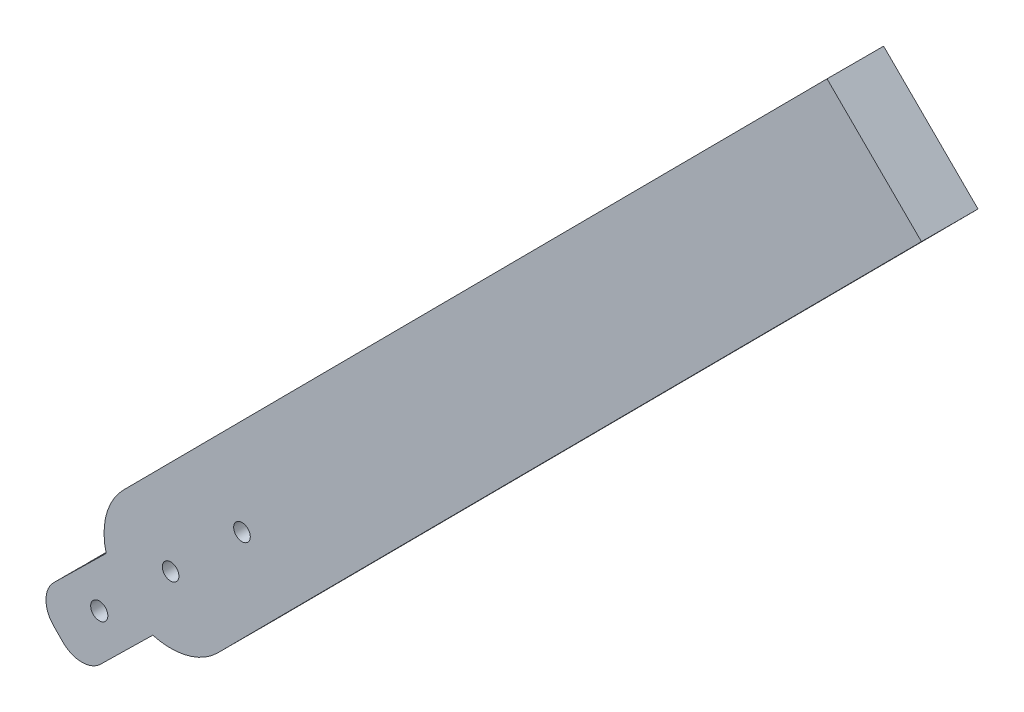
ISO-10303-21;
HEADER;
FILE_DESCRIPTION(('STEP AP214'),'2;1');
FILE_NAME('part.step','',(''),(''),'','','');
FILE_SCHEMA(('AUTOMOTIVE_DESIGN { 1 0 10303 214 1 1 1 1 }'));
ENDSEC;
DATA;
#1=APPLICATION_CONTEXT('core data for automotive mechanical design processes');
#2=APPLICATION_PROTOCOL_DEFINITION('international standard','automotive_design',2000,#1);
#3=PRODUCT_CONTEXT('',#1,'mechanical');
#4=PRODUCT('Part','Part','',(#3));
#5=PRODUCT_RELATED_PRODUCT_CATEGORY('part','',(#4));
#6=PRODUCT_DEFINITION_FORMATION('','',#4);
#7=PRODUCT_DEFINITION_CONTEXT('part definition',#1,'design');
#8=PRODUCT_DEFINITION('design','',#6,#7);
#9=PRODUCT_DEFINITION_SHAPE('','',#8);
#10=(LENGTH_UNIT() NAMED_UNIT(*) SI_UNIT(.MILLI.,.METRE.));
#11=(NAMED_UNIT(*) PLANE_ANGLE_UNIT() SI_UNIT($,.RADIAN.));
#12=(NAMED_UNIT(*) SI_UNIT($,.STERADIAN.) SOLID_ANGLE_UNIT());
#13=UNCERTAINTY_MEASURE_WITH_UNIT(LENGTH_MEASURE(1.E-05),#10,'distance_accuracy_value','');
#14=(GEOMETRIC_REPRESENTATION_CONTEXT(3) GLOBAL_UNCERTAINTY_ASSIGNED_CONTEXT((#13)) GLOBAL_UNIT_ASSIGNED_CONTEXT((#10,
#11,#12)) REPRESENTATION_CONTEXT('',''));
#15=CARTESIAN_POINT('',(0.,0.,0.));
#16=DIRECTION('',(0.,0.,1.));
#17=DIRECTION('',(1.,0.,0.));
#18=AXIS2_PLACEMENT_3D('',#15,#16,#17);
#19=CARTESIAN_POINT('',(21.4462981813917,20.9775187835653,0.));
#20=DIRECTION('',(0.,0.,1.));
#21=DIRECTION('',(1.,0.,0.));
#22=AXIS2_PLACEMENT_3D('',#19,#20,#21);
#23=CYLINDRICAL_SURFACE('',#22,2.5);
#24=CARTESIAN_POINT('',(21.4462981813917,20.9775187835653,6.9));
#25=DIRECTION('',(0.,0.,-1.));
#26=DIRECTION('',(0.,1.,0.));
#27=AXIS2_PLACEMENT_3D('',#24,#25,#26);
#28=CIRCLE('',#27,2.5);
#29=CARTESIAN_POINT('',(21.4462981813917,23.4775187835653,6.9));
#30=VERTEX_POINT('',#29);
#31=EDGE_CURVE('E311',#30,#30,#28,.F.);
#32=ORIENTED_EDGE('',*,*,#31,.T.);
#33=EDGE_LOOP('',(#32));
#34=FACE_BOUND('',#33,.T.);
#35=CARTESIAN_POINT('',(21.4462981813917,20.9775187835653,0.));
#36=DIRECTION('',(0.,0.,1.));
#37=DIRECTION('',(1.,0.,0.));
#38=AXIS2_PLACEMENT_3D('',#35,#36,#37);
#39=CIRCLE('',#38,2.5);
#40=CARTESIAN_POINT('',(23.9462981813917,20.9775187835653,0.));
#41=VERTEX_POINT('',#40);
#42=EDGE_CURVE('E404',#41,#41,#39,.T.);
#43=ORIENTED_EDGE('',*,*,#42,.F.);
#44=EDGE_LOOP('',(#43));
#45=FACE_BOUND('',#44,.T.);
#46=ADVANCED_FACE('F77',(#34,#45),#23,.F.);
#47=CARTESIAN_POINT('',(0.,0.,17.));
#48=DIRECTION('',(0.,0.,-1.));
#49=DIRECTION('',(-1.,0.,0.));
#50=AXIS2_PLACEMENT_3D('',#47,#48,#49);
#51=CYLINDRICAL_SURFACE('',#50,20.);
#52=CARTESIAN_POINT('',(0.,0.,10.1));
#53=DIRECTION('',(0.,0.,-1.));
#54=DIRECTION('',(0.,1.,0.));
#55=AXIS2_PLACEMENT_3D('',#52,#53,#54);
#56=CIRCLE('',#55,20.);
#57=CARTESIAN_POINT('',(7.81274003272556,-18.410896045034,10.1));
#58=VERTEX_POINT('',#57);
#59=CARTESIAN_POINT('',(-5.35659237901325,-19.2693258336948,10.1));
#60=VERTEX_POINT('',#59);
#61=EDGE_CURVE('E436',#58,#60,#56,.T.);
#62=ORIENTED_EDGE('',*,*,#61,.F.);
#63=DIRECTION('',(0.,0.,-1.));
#64=VECTOR('',#63,1.);
#65=CARTESIAN_POINT('',(7.81274003272556,-18.410896045034,17.));
#66=LINE('',#65,#64);
#67=CARTESIAN_POINT('',(7.81274003272556,-18.410896045034,6.9));
#68=VERTEX_POINT('',#67);
#69=EDGE_CURVE('E438',#68,#58,#66,.F.);
#70=ORIENTED_EDGE('',*,*,#69,.F.);
#71=CARTESIAN_POINT('',(0.,0.,6.9));
#72=DIRECTION('',(0.,0.,-1.));
#73=DIRECTION('',(0.,1.,0.));
#74=AXIS2_PLACEMENT_3D('',#71,#72,#73);
#75=CIRCLE('',#74,20.);
#76=CARTESIAN_POINT('',(-5.35659237901325,-19.2693258336948,6.9));
#77=VERTEX_POINT('',#76);
#78=EDGE_CURVE('E301',#68,#77,#75,.T.);
#79=ORIENTED_EDGE('',*,*,#78,.T.);
#80=DIRECTION('',(0.,0.,-1.));
#81=VECTOR('',#80,1.);
#82=CARTESIAN_POINT('',(-5.35659237901325,-19.2693258336948,17.));
#83=LINE('',#82,#81);
#84=CARTESIAN_POINT('',(-5.35659237901325,-19.2693258336948,0.));
#85=VERTEX_POINT('',#84);
#86=EDGE_CURVE('E482',#77,#85,#83,.T.);
#87=ORIENTED_EDGE('',*,*,#86,.T.);
#88=CARTESIAN_POINT('',(0.,0.,0.));
#89=DIRECTION('',(0.,0.,1.));
#90=DIRECTION('',(1.,0.,0.));
#91=AXIS2_PLACEMENT_3D('',#88,#89,#90);
#92=CIRCLE('',#91,20.);
#93=CARTESIAN_POINT('',(14.185229692451,-14.0989098363103,0.));
#94=VERTEX_POINT('',#93);
#95=EDGE_CURVE('E466',#85,#94,#92,.T.);
#96=ORIENTED_EDGE('',*,*,#95,.T.);
#97=DIRECTION('',(0.,0.,-1.));
#98=VECTOR('',#97,1.);
#99=CARTESIAN_POINT('',(14.185229692451,-14.0989098363103,17.));
#100=LINE('',#99,#98);
#101=CARTESIAN_POINT('',(14.185229692451,-14.0989098363103,17.));
#102=VERTEX_POINT('',#101);
#103=EDGE_CURVE('E305',#102,#94,#100,.T.);
#104=ORIENTED_EDGE('',*,*,#103,.F.);
#105=CARTESIAN_POINT('',(0.,0.,17.));
#106=DIRECTION('',(0.,0.,1.));
#107=DIRECTION('',(1.,0.,0.));
#108=AXIS2_PLACEMENT_3D('',#105,#106,#107);
#109=CIRCLE('',#108,20.);
#110=CARTESIAN_POINT('',(-5.35659237901325,-19.2693258336948,17.));
#111=VERTEX_POINT('',#110);
#112=EDGE_CURVE('E453',#111,#102,#109,.T.);
#113=ORIENTED_EDGE('',*,*,#112,.F.);
#114=EDGE_CURVE('E478',#111,#60,#83,.T.);
#115=ORIENTED_EDGE('',*,*,#114,.T.);
#116=EDGE_LOOP('',(#62,#70,#79,#87,#96,#104,#113,#115));
#117=FACE_BOUND('',#116,.T.);
#118=ADVANCED_FACE('F372',(#117),#51,.T.);
#119=CARTESIAN_POINT('',(0.,0.,10.1));
#120=DIRECTION('',(0.,0.,-1.));
#121=DIRECTION('',(0.,1.,0.));
#122=AXIS2_PLACEMENT_3D('',#119,#120,#121);
#123=CIRCLE('',#122,20.);
#124=CARTESIAN_POINT('',(-19.3660218752861,-4.99571783890379,10.1));
#125=VERTEX_POINT('',#124);
#126=CARTESIAN_POINT('',(-18.2617462922339,8.15528186870816,10.1));
#127=VERTEX_POINT('',#126);
#128=EDGE_CURVE('E428',#125,#127,#123,.T.);
#129=ORIENTED_EDGE('',*,*,#128,.F.);
#130=DIRECTION('',(0.,0.,-1.));
#131=VECTOR('',#130,1.);
#132=CARTESIAN_POINT('',(-19.3660218752861,-4.9957178389038,17.));
#133=LINE('',#132,#131);
#134=CARTESIAN_POINT('',(-19.3660218752861,-4.9957178389038,17.));
#135=VERTEX_POINT('',#134);
#136=EDGE_CURVE('E483',#135,#125,#133,.T.);
#137=ORIENTED_EDGE('',*,*,#136,.F.);
#138=CARTESIAN_POINT('',(-14.185229692451,14.0989098363103,17.));
#139=VERTEX_POINT('',#138);
#140=EDGE_CURVE('E458',#139,#135,#109,.T.);
#141=ORIENTED_EDGE('',*,*,#140,.F.);
#142=DIRECTION('',(0.,0.,-1.));
#143=VECTOR('',#142,1.);
#144=CARTESIAN_POINT('',(-14.185229692451,14.0989098363103,17.));
#145=LINE('',#144,#143);
#146=CARTESIAN_POINT('',(-14.185229692451,14.0989098363103,0.));
#147=VERTEX_POINT('',#146);
#148=EDGE_CURVE('E486',#139,#147,#145,.T.);
#149=ORIENTED_EDGE('',*,*,#148,.T.);
#150=CARTESIAN_POINT('',(-19.3660218752861,-4.9957178389038,0.));
#151=VERTEX_POINT('',#150);
#152=EDGE_CURVE('E457',#147,#151,#92,.T.);
#153=ORIENTED_EDGE('',*,*,#152,.T.);
#154=CARTESIAN_POINT('',(-19.3660218752861,-4.9957178389038,6.9));
#155=VERTEX_POINT('',#154);
#156=EDGE_CURVE('E481',#155,#151,#133,.T.);
#157=ORIENTED_EDGE('',*,*,#156,.F.);
#158=CARTESIAN_POINT('',(0.,0.,6.9));
#159=DIRECTION('',(0.,0.,-1.));
#160=DIRECTION('',(0.,1.,0.));
#161=AXIS2_PLACEMENT_3D('',#158,#159,#160);
#162=CIRCLE('',#161,20.);
#163=CARTESIAN_POINT('',(-18.2617462922339,8.15528186870816,6.9));
#164=VERTEX_POINT('',#163);
#165=EDGE_CURVE('E262',#155,#164,#162,.T.);
#166=ORIENTED_EDGE('',*,*,#165,.T.);
#167=DIRECTION('',(0.,0.,-1.));
#168=VECTOR('',#167,1.);
#169=CARTESIAN_POINT('',(-18.2617462922339,8.15528186870815,17.));
#170=LINE('',#169,#168);
#171=EDGE_CURVE('E302',#127,#164,#170,.T.);
#172=ORIENTED_EDGE('',*,*,#171,.F.);
#173=EDGE_LOOP('',(#129,#137,#141,#149,#153,#157,#166,#172));
#174=FACE_BOUND('',#173,.T.);
#175=ADVANCED_FACE('F381',(#174),#51,.T.);
#176=CARTESIAN_POINT('',(-26.6613329717925,-28.9702550816785,17.));
#177=DIRECTION('',(0.,0.,-1.));
#178=DIRECTION('',(-1.,0.,0.));
#179=AXIS2_PLACEMENT_3D('',#176,#177,#178);
#180=CYLINDRICAL_SURFACE('',#179,8.00000000000002);
#181=DIRECTION('',(0.,0.,-1.));
#182=VECTOR('',#181,1.);
#183=CARTESIAN_POINT('',(-32.3707761697089,-34.5740268801876,17.));
#184=LINE('',#183,#182);
#185=CARTESIAN_POINT('',(-32.3707761697089,-34.5740268801876,17.));
#186=VERTEX_POINT('',#185);
#187=CARTESIAN_POINT('',(-32.3707761697089,-34.5740268801876,10.1));
#188=VERTEX_POINT('',#187);
#189=EDGE_CURVE('E279',#186,#188,#184,.T.);
#190=ORIENTED_EDGE('',*,*,#189,.T.);
#191=CARTESIAN_POINT('',(-26.6613329717925,-28.9702550816785,10.1));
#192=DIRECTION('',(0.,0.,-1.));
#193=DIRECTION('',(0.,1.,0.));
#194=AXIS2_PLACEMENT_3D('',#191,#192,#193);
#195=CIRCLE('',#194,8.00000000000002);
#196=CARTESIAN_POINT('',(-21.0575611732833,-34.6796982795949,10.1));
#197=VERTEX_POINT('',#196);
#198=EDGE_CURVE('E433',#188,#197,#195,.F.);
#199=ORIENTED_EDGE('',*,*,#198,.T.);
#200=DIRECTION('',(0.,0.,-1.));
#201=VECTOR('',#200,1.);
#202=CARTESIAN_POINT('',(-21.0575611732833,-34.6796982795949,17.));
#203=LINE('',#202,#201);
#204=CARTESIAN_POINT('',(-21.0575611732833,-34.6796982795949,17.));
#205=VERTEX_POINT('',#204);
#206=EDGE_CURVE('E289',#205,#197,#203,.T.);
#207=ORIENTED_EDGE('',*,*,#206,.F.);
#208=CARTESIAN_POINT('',(-26.6613329717925,-28.9702550816785,17.));
#209=DIRECTION('',(0.,0.,-1.));
#210=DIRECTION('',(-1.,0.,0.));
#211=AXIS2_PLACEMENT_3D('',#208,#209,#210);
#212=CIRCLE('',#211,8.00000000000002);
#213=EDGE_CURVE('E497',#205,#186,#212,.T.);
#214=ORIENTED_EDGE('',*,*,#213,.T.);
#215=EDGE_LOOP('',(#190,#199,#207,#214));
#216=FACE_BOUND('',#215,.T.);
#217=ADVANCED_FACE('F560',(#216),#180,.T.);
#218=CARTESIAN_POINT('',(-35.1726620689634,-31.7193052812294,17.));
#219=DIRECTION('',(0.71368039973955,0.700471474813641,0.));
#220=DIRECTION('',(-0.700471474813641,0.71368039973955,0.));
#221=AXIS2_PLACEMENT_3D('',#218,#219,#220);
#222=PLANE('',#221);
#223=DIRECTION('',(0.700471474813641,-0.71368039973955,0.));
#224=VECTOR('',#223,1.);
#225=CARTESIAN_POINT('',(-33.7717191193362,-33.1466660807085,10.1));
#226=LINE('',#225,#224);
#227=CARTESIAN_POINT('',(-35.1726620689635,-31.7193052812294,10.1));
#228=VERTEX_POINT('',#227);
#229=EDGE_CURVE('E272',#228,#188,#226,.T.);
#230=ORIENTED_EDGE('',*,*,#229,.T.);
#231=ORIENTED_EDGE('',*,*,#189,.F.);
#232=DIRECTION('',(0.700471474813641,-0.71368039973955,0.));
#233=VECTOR('',#232,1.);
#234=CARTESIAN_POINT('',(-35.1726620689634,-31.7193052812294,17.));
#235=LINE('',#234,#233);
#236=CARTESIAN_POINT('',(-35.1726620689634,-31.7193052812294,17.));
#237=VERTEX_POINT('',#236);
#238=EDGE_CURVE('E501',#237,#186,#235,.T.);
#239=ORIENTED_EDGE('',*,*,#238,.F.);
#240=DIRECTION('',(0.,0.,-1.));
#241=VECTOR('',#240,1.);
#242=CARTESIAN_POINT('',(-35.1726620689634,-31.7193052812294,17.));
#243=LINE('',#242,#241);
#244=EDGE_CURVE('E278',#237,#228,#243,.T.);
#245=ORIENTED_EDGE('',*,*,#244,.T.);
#246=EDGE_LOOP('',(#230,#231,#239,#245));
#247=FACE_BOUND('',#246,.T.);
#248=ADVANCED_FACE('F558',(#247),#222,.F.);
#249=CARTESIAN_POINT('',(-5.35659237901325,-19.2693258336948,17.));
#250=DIRECTION('',(0.70047147481364,-0.71368039973955,0.));
#251=DIRECTION('',(0.71368039973955,0.70047147481364,0.));
#252=AXIS2_PLACEMENT_3D('',#249,#250,#251);
#253=PLANE('',#252);
#254=ORIENTED_EDGE('',*,*,#206,.T.);
#255=DIRECTION('',(0.71368039973955,0.70047147481364,0.));
#256=VECTOR('',#255,1.);
#257=CARTESIAN_POINT('',(-5.35659237901325,-19.2693258336948,10.1));
#258=LINE('',#257,#256);
#259=EDGE_CURVE('E430',#197,#60,#258,.T.);
#260=ORIENTED_EDGE('',*,*,#259,.T.);
#261=ORIENTED_EDGE('',*,*,#114,.F.);
#262=DIRECTION('',(-0.71368039973955,-0.70047147481364,0.));
#263=VECTOR('',#262,1.);
#264=CARTESIAN_POINT('',(-5.35659237901325,-19.2693258336948,17.));
#265=LINE('',#264,#263);
#266=EDGE_CURVE('E494',#111,#205,#265,.T.);
#267=ORIENTED_EDGE('',*,*,#266,.T.);
#268=EDGE_LOOP('',(#254,#260,#261,#267));
#269=FACE_BOUND('',#268,.T.);
#270=ADVANCED_FACE('F562',(#269),#253,.T.);
#271=CARTESIAN_POINT('',(-29.463218871047,-26.1155334827203,17.));
#272=DIRECTION('',(0.,0.,-1.));
#273=DIRECTION('',(-1.,0.,0.));
#274=AXIS2_PLACEMENT_3D('',#271,#272,#273);
#275=CYLINDRICAL_SURFACE('',#274,8.00000000000002);
#276=CARTESIAN_POINT('',(-29.463218871047,-26.1155334827203,10.1));
#277=DIRECTION('',(0.,0.,-1.));
#278=DIRECTION('',(0.,1.,0.));
#279=AXIS2_PLACEMENT_3D('',#276,#277,#278);
#280=CIRCLE('',#279,8.00000000000002);
#281=CARTESIAN_POINT('',(-35.0669906695562,-20.4060902848039,10.1));
#282=VERTEX_POINT('',#281);
#283=EDGE_CURVE('E426',#228,#282,#280,.T.);
#284=ORIENTED_EDGE('',*,*,#283,.F.);
#285=ORIENTED_EDGE('',*,*,#244,.F.);
#286=CARTESIAN_POINT('',(-29.463218871047,-26.1155334827203,17.));
#287=DIRECTION('',(0.,0.,1.));
#288=DIRECTION('',(1.,0.,0.));
#289=AXIS2_PLACEMENT_3D('',#286,#287,#288);
#290=CIRCLE('',#289,8.00000000000002);
#291=CARTESIAN_POINT('',(-35.0669906695562,-20.4060902848039,17.));
#292=VERTEX_POINT('',#291);
#293=EDGE_CURVE('E503',#292,#237,#290,.T.);
#294=ORIENTED_EDGE('',*,*,#293,.F.);
#295=DIRECTION('',(0.,0.,-1.));
#296=VECTOR('',#295,1.);
#297=CARTESIAN_POINT('',(-35.0669906695562,-20.4060902848039,17.));
#298=LINE('',#297,#296);
#299=EDGE_CURVE('E286',#292,#282,#298,.T.);
#300=ORIENTED_EDGE('',*,*,#299,.T.);
#301=EDGE_LOOP('',(#284,#285,#294,#300));
#302=FACE_BOUND('',#301,.T.);
#303=ADVANCED_FACE('F552',(#302),#275,.T.);
#304=CARTESIAN_POINT('',(-19.3660218752861,-4.9957178389038,17.));
#305=DIRECTION('',(0.70047147481364,-0.71368039973955,0.));
#306=DIRECTION('',(0.71368039973955,0.70047147481364,0.));
#307=AXIS2_PLACEMENT_3D('',#304,#305,#306);
#308=PLANE('',#307);
#309=DIRECTION('',(0.71368039973955,0.70047147481364,0.));
#310=VECTOR('',#309,1.);
#311=CARTESIAN_POINT('',(-19.3660218752861,-4.9957178389038,10.1));
#312=LINE('',#311,#310);
#313=EDGE_CURVE('E300',#282,#125,#312,.T.);
#314=ORIENTED_EDGE('',*,*,#313,.F.);
#315=ORIENTED_EDGE('',*,*,#299,.F.);
#316=DIRECTION('',(-0.71368039973955,-0.70047147481364,0.));
#317=VECTOR('',#316,1.);
#318=CARTESIAN_POINT('',(-19.3660218752861,-4.9957178389038,17.));
#319=LINE('',#318,#317);
#320=EDGE_CURVE('E505',#135,#292,#319,.T.);
#321=ORIENTED_EDGE('',*,*,#320,.F.);
#322=ORIENTED_EDGE('',*,*,#136,.T.);
#323=EDGE_LOOP('',(#314,#315,#321,#322));
#324=FACE_BOUND('',#323,.T.);
#325=ADVANCED_FACE('F546',(#324),#308,.F.);
#326=CARTESIAN_POINT('',(-21.4462981813917,-20.9775187835653,0.));
#327=DIRECTION('',(0.,0.,1.));
#328=DIRECTION('',(1.,0.,0.));
#329=AXIS2_PLACEMENT_3D('',#326,#327,#328);
#330=CYLINDRICAL_SURFACE('',#329,2.58350632082268);
#331=CARTESIAN_POINT('',(-21.4462981813917,-20.9775187835653,17.));
#332=DIRECTION('',(0.,0.,1.));
#333=DIRECTION('',(1.,0.,0.));
#334=AXIS2_PLACEMENT_3D('',#331,#332,#333);
#335=CIRCLE('',#334,2.58350632082268);
#336=CARTESIAN_POINT('',(-18.862791860569,-20.9775187835653,17.));
#337=VERTEX_POINT('',#336);
#338=EDGE_CURVE('E440',#337,#337,#335,.T.);
#339=ORIENTED_EDGE('',*,*,#338,.T.);
#340=EDGE_LOOP('',(#339));
#341=FACE_BOUND('',#340,.T.);
#342=CARTESIAN_POINT('',(-21.4462981813917,-20.9775187835653,10.1));
#343=DIRECTION('',(0.,0.,-1.));
#344=DIRECTION('',(0.,1.,0.));
#345=AXIS2_PLACEMENT_3D('',#342,#343,#344);
#346=CIRCLE('',#345,2.58350632082268);
#347=CARTESIAN_POINT('',(-21.4462981813917,-18.3940124627426,10.1));
#348=VERTEX_POINT('',#347);
#349=EDGE_CURVE('E297',#348,#348,#346,.F.);
#350=ORIENTED_EDGE('',*,*,#349,.F.);
#351=EDGE_LOOP('',(#350));
#352=FACE_BOUND('',#351,.T.);
#353=ADVANCED_FACE('F591',(#341,#352),#330,.F.);
#354=CARTESIAN_POINT('',(14.185229692451,-14.0989098363103,17.));
#355=DIRECTION('',(-0.709261484622549,0.704945491815515,0.));
#356=DIRECTION('',(-0.704945491815515,-0.709261484622549,0.));
#357=AXIS2_PLACEMENT_3D('',#354,#355,#356);
#358=PLANE('',#357);
#359=DIRECTION('',(0.,0.,1.));
#360=VECTOR('',#359,1.);
#361=CARTESIAN_POINT('',(15.6580782269935,-12.6170438617604,17.));
#362=LINE('',#361,#360);
#363=CARTESIAN_POINT('',(15.6580782269935,-12.6170438617604,6.9));
#364=VERTEX_POINT('',#363);
#365=CARTESIAN_POINT('',(15.6580782269935,-12.6170438617604,10.1));
#366=VERTEX_POINT('',#365);
#367=EDGE_CURVE('E317',#364,#366,#362,.T.);
#368=ORIENTED_EDGE('',*,*,#367,.T.);
#369=DIRECTION('',(0.704945491815515,0.709261484622549,0.));
#370=VECTOR('',#369,1.);
#371=CARTESIAN_POINT('',(14.185229692451,-14.0989098363103,10.1));
#372=LINE('',#371,#370);
#373=CARTESIAN_POINT('',(54.4300802768468,26.3923377924798,10.1));
#374=VERTEX_POINT('',#373);
#375=EDGE_CURVE('E309',#366,#374,#372,.T.);
#376=ORIENTED_EDGE('',*,*,#375,.T.);
#377=DIRECTION('',(0.,0.,-1.));
#378=VECTOR('',#377,1.);
#379=CARTESIAN_POINT('',(54.4300802768468,26.3923377924798,17.));
#380=LINE('',#379,#378);
#381=CARTESIAN_POINT('',(54.4300802768468,26.3923377924798,6.89999999999999));
#382=VERTEX_POINT('',#381);
#383=EDGE_CURVE('E304',#374,#382,#380,.T.);
#384=ORIENTED_EDGE('',*,*,#383,.T.);
#385=DIRECTION('',(-0.704945491815515,-0.709261484622549,0.));
#386=VECTOR('',#385,1.);
#387=CARTESIAN_POINT('',(14.185229692451,-14.0989098363103,6.9));
#388=LINE('',#387,#386);
#389=EDGE_CURVE('E314',#382,#364,#388,.T.);
#390=ORIENTED_EDGE('',*,*,#389,.T.);
#391=EDGE_LOOP('',(#368,#376,#384,#390));
#392=FACE_BOUND('',#391,.T.);
#393=DIRECTION('',(0.704945491815515,0.709261484622549,0.));
#394=VECTOR('',#393,1.);
#395=CARTESIAN_POINT('',(14.185229692451,-14.0989098363103,0.));
#396=LINE('',#395,#394);
#397=CARTESIAN_POINT('',(225.668877237105,198.679535550454,0.));
#398=VERTEX_POINT('',#397);
#399=EDGE_CURVE('E469',#94,#398,#396,.T.);
#400=ORIENTED_EDGE('',*,*,#399,.T.);
#401=DIRECTION('',(0.,0.,-1.));
#402=VECTOR('',#401,1.);
#403=CARTESIAN_POINT('',(225.668877237105,198.679535550454,17.));
#404=LINE('',#403,#402);
#405=CARTESIAN_POINT('',(225.668877237105,198.679535550454,17.));
#406=VERTEX_POINT('',#405);
#407=EDGE_CURVE('E490',#406,#398,#404,.T.);
#408=ORIENTED_EDGE('',*,*,#407,.F.);
#409=DIRECTION('',(0.704945491815515,0.709261484622549,0.));
#410=VECTOR('',#409,1.);
#411=CARTESIAN_POINT('',(14.185229692451,-14.0989098363103,17.));
#412=LINE('',#411,#410);
#413=EDGE_CURVE('E456',#102,#406,#412,.T.);
#414=ORIENTED_EDGE('',*,*,#413,.F.);
#415=ORIENTED_EDGE('',*,*,#103,.T.);
#416=EDGE_LOOP('',(#400,#408,#414,#415));
#417=FACE_BOUND('',#416,.T.);
#418=ADVANCED_FACE('F567',(#392,#417),#358,.F.);
#419=CARTESIAN_POINT('',(211.483647544654,212.778445386765,17.));
#420=DIRECTION('',(0.704945491815514,0.709261484622549,0.));
#421=DIRECTION('',(-0.709261484622549,0.704945491815514,0.));
#422=AXIS2_PLACEMENT_3D('',#419,#420,#421);
#423=PLANE('',#422);
#424=DIRECTION('',(0.709261484622549,-0.704945491815514,0.));
#425=VECTOR('',#424,1.);
#426=CARTESIAN_POINT('',(211.483647544654,212.778445386765,0.));
#427=LINE('',#426,#425);
#428=CARTESIAN_POINT('',(197.298417852203,226.877355223075,0.));
#429=VERTEX_POINT('',#428);
#430=EDGE_CURVE('E472',#429,#398,#427,.T.);
#431=ORIENTED_EDGE('',*,*,#430,.F.);
#432=DIRECTION('',(0.,0.,-1.));
#433=VECTOR('',#432,1.);
#434=CARTESIAN_POINT('',(197.298417852203,226.877355223075,17.));
#435=LINE('',#434,#433);
#436=CARTESIAN_POINT('',(197.298417852203,226.877355223075,17.));
#437=VERTEX_POINT('',#436);
#438=EDGE_CURVE('E488',#437,#429,#435,.T.);
#439=ORIENTED_EDGE('',*,*,#438,.F.);
#440=DIRECTION('',(0.709261484622549,-0.704945491815514,0.));
#441=VECTOR('',#440,1.);
#442=CARTESIAN_POINT('',(211.483647544654,212.778445386765,17.));
#443=LINE('',#442,#441);
#444=EDGE_CURVE('E460',#437,#406,#443,.T.);
#445=ORIENTED_EDGE('',*,*,#444,.T.);
#446=ORIENTED_EDGE('',*,*,#407,.T.);
#447=EDGE_LOOP('',(#431,#439,#445,#446));
#448=FACE_BOUND('',#447,.T.);
#449=ADVANCED_FACE('F601',(#448),#423,.T.);
#450=CARTESIAN_POINT('',(-14.185229692451,14.0989098363103,17.));
#451=DIRECTION('',(-0.709261484622549,0.704945491815515,0.));
#452=DIRECTION('',(-0.704945491815515,-0.709261484622549,0.));
#453=AXIS2_PLACEMENT_3D('',#450,#451,#452);
#454=PLANE('',#453);
#455=DIRECTION('',(0.704945491815515,0.709261484622549,0.));
#456=VECTOR('',#455,1.);
#457=CARTESIAN_POINT('',(-9.18765369883092,19.1270832339729,10.1));
#458=LINE('',#457,#456);
#459=CARTESIAN_POINT('',(-12.7123811579085,15.5807758108602,10.1));
#460=VERTEX_POINT('',#459);
#461=CARTESIAN_POINT('',(26.0596208919448,54.5901574651004,10.1));
#462=VERTEX_POINT('',#461);
#463=EDGE_CURVE('E354',#460,#462,#458,.T.);
#464=ORIENTED_EDGE('',*,*,#463,.F.);
#465=DIRECTION('',(0.,0.,1.));
#466=VECTOR('',#465,1.);
#467=CARTESIAN_POINT('',(-12.7123811579085,15.5807758108602,6.9));
#468=LINE('',#467,#466);
#469=CARTESIAN_POINT('',(-12.7123811579085,15.5807758108602,6.9));
#470=VERTEX_POINT('',#469);
#471=EDGE_CURVE('E328',#460,#470,#468,.F.);
#472=ORIENTED_EDGE('',*,*,#471,.T.);
#473=DIRECTION('',(-0.704945491815515,-0.709261484622549,0.));
#474=VECTOR('',#473,1.);
#475=CARTESIAN_POINT('',(-9.18765369883092,19.1270832339729,6.9));
#476=LINE('',#475,#474);
#477=CARTESIAN_POINT('',(26.0596208919448,54.5901574651004,6.89999999999999));
#478=VERTEX_POINT('',#477);
#479=EDGE_CURVE('E638',#478,#470,#476,.T.);
#480=ORIENTED_EDGE('',*,*,#479,.F.);
#481=DIRECTION('',(0.,0.,-1.));
#482=VECTOR('',#481,1.);
#483=CARTESIAN_POINT('',(26.0596208919448,54.5901574651004,10.1));
#484=LINE('',#483,#482);
#485=EDGE_CURVE('E325',#478,#462,#484,.F.);
#486=ORIENTED_EDGE('',*,*,#485,.T.);
#487=EDGE_LOOP('',(#464,#472,#480,#486));
#488=FACE_BOUND('',#487,.T.);
#489=DIRECTION('',(0.704945491815515,0.709261484622549,0.));
#490=VECTOR('',#489,1.);
#491=CARTESIAN_POINT('',(-14.185229692451,14.0989098363103,0.));
#492=LINE('',#491,#490);
#493=EDGE_CURVE('E475',#147,#429,#492,.T.);
#494=ORIENTED_EDGE('',*,*,#493,.F.);
#495=ORIENTED_EDGE('',*,*,#148,.F.);
#496=DIRECTION('',(0.704945491815515,0.709261484622549,0.));
#497=VECTOR('',#496,1.);
#498=CARTESIAN_POINT('',(-14.185229692451,14.0989098363103,17.));
#499=LINE('',#498,#497);
#500=EDGE_CURVE('E463',#139,#437,#499,.T.);
#501=ORIENTED_EDGE('',*,*,#500,.T.);
#502=ORIENTED_EDGE('',*,*,#438,.T.);
#503=EDGE_LOOP('',(#494,#495,#501,#502));
#504=FACE_BOUND('',#503,.T.);
#505=ADVANCED_FACE('F572',(#488,#504),#454,.T.);
#506=CARTESIAN_POINT('',(0.,0.,17.));
#507=DIRECTION('',(0.,0.,1.));
#508=DIRECTION('',(1.,0.,0.));
#509=AXIS2_PLACEMENT_3D('',#506,#507,#508);
#510=PLANE('',#509);
#511=CARTESIAN_POINT('',(21.4462981813917,20.9775187835653,17.));
#512=DIRECTION('',(0.,0.,1.));
#513=DIRECTION('',(1.,0.,0.));
#514=AXIS2_PLACEMENT_3D('',#511,#512,#513);
#515=CIRCLE('',#514,2.5);
#516=CARTESIAN_POINT('',(23.9462981813917,20.9775187835653,17.));
#517=VERTEX_POINT('',#516);
#518=EDGE_CURVE('E402',#517,#517,#515,.T.);
#519=ORIENTED_EDGE('',*,*,#518,.F.);
#520=EDGE_LOOP('',(#519));
#521=FACE_BOUND('',#520,.T.);
#522=ORIENTED_EDGE('',*,*,#338,.F.);
#523=EDGE_LOOP('',(#522));
#524=FACE_BOUND('',#523,.T.);
#525=CARTESIAN_POINT('',(0.,0.,17.));
#526=DIRECTION('',(0.,0.,1.));
#527=DIRECTION('',(1.,0.,0.));
#528=AXIS2_PLACEMENT_3D('',#525,#526,#527);
#529=CIRCLE('',#528,2.5);
#530=CARTESIAN_POINT('',(2.5,0.,17.));
#531=VERTEX_POINT('',#530);
#532=EDGE_CURVE('E444',#531,#531,#529,.T.);
#533=ORIENTED_EDGE('',*,*,#532,.F.);
#534=EDGE_LOOP('',(#533));
#535=FACE_BOUND('',#534,.T.);
#536=ORIENTED_EDGE('',*,*,#112,.T.);
#537=ORIENTED_EDGE('',*,*,#413,.T.);
#538=ORIENTED_EDGE('',*,*,#444,.F.);
#539=ORIENTED_EDGE('',*,*,#500,.F.);
#540=ORIENTED_EDGE('',*,*,#140,.T.);
#541=ORIENTED_EDGE('',*,*,#320,.T.);
#542=ORIENTED_EDGE('',*,*,#293,.T.);
#543=ORIENTED_EDGE('',*,*,#238,.T.);
#544=ORIENTED_EDGE('',*,*,#213,.F.);
#545=ORIENTED_EDGE('',*,*,#266,.F.);
#546=EDGE_LOOP('',(#536,#537,#538,#539,#540,#541,#542,#543,#544,#545));
#547=FACE_BOUND('',#546,.T.);
#548=ADVANCED_FACE('F537',(#521,#524,#535,#547),#510,.T.);
#549=CARTESIAN_POINT('',(0.,0.,0.));
#550=DIRECTION('',(0.,0.,1.));
#551=DIRECTION('',(1.,0.,0.));
#552=AXIS2_PLACEMENT_3D('',#549,#550,#551);
#553=PLANE('',#552);
#554=ORIENTED_EDGE('',*,*,#42,.T.);
#555=EDGE_LOOP('',(#554));
#556=FACE_BOUND('',#555,.T.);
#557=CARTESIAN_POINT('',(-21.4462981813917,-20.9775187835653,0.));
#558=DIRECTION('',(0.,0.,1.));
#559=DIRECTION('',(1.,0.,0.));
#560=AXIS2_PLACEMENT_3D('',#557,#558,#559);
#561=CIRCLE('',#560,2.58350632082268);
#562=CARTESIAN_POINT('',(-18.862791860569,-20.9775187835653,0.));
#563=VERTEX_POINT('',#562);
#564=EDGE_CURVE('E441',#563,#563,#561,.T.);
#565=ORIENTED_EDGE('',*,*,#564,.T.);
#566=EDGE_LOOP('',(#565));
#567=FACE_BOUND('',#566,.T.);
#568=CARTESIAN_POINT('',(0.,0.,0.));
#569=DIRECTION('',(0.,0.,1.));
#570=DIRECTION('',(1.,0.,0.));
#571=AXIS2_PLACEMENT_3D('',#568,#569,#570);
#572=CIRCLE('',#571,2.5);
#573=CARTESIAN_POINT('',(2.5,0.,0.));
#574=VERTEX_POINT('',#573);
#575=EDGE_CURVE('E447',#574,#574,#572,.T.);
#576=ORIENTED_EDGE('',*,*,#575,.T.);
#577=EDGE_LOOP('',(#576));
#578=FACE_BOUND('',#577,.T.);
#579=ORIENTED_EDGE('',*,*,#95,.F.);
#580=DIRECTION('',(-0.71368039973955,-0.70047147481364,0.));
#581=VECTOR('',#580,1.);
#582=CARTESIAN_POINT('',(-5.35659237901325,-19.2693258336948,0.));
#583=LINE('',#582,#581);
#584=CARTESIAN_POINT('',(-21.0575611732833,-34.6796982795949,0.));
#585=VERTEX_POINT('',#584);
#586=EDGE_CURVE('E450',#85,#585,#583,.T.);
#587=ORIENTED_EDGE('',*,*,#586,.T.);
#588=CARTESIAN_POINT('',(-26.6613329717925,-28.9702550816785,0.));
#589=DIRECTION('',(0.,0.,-1.));
#590=DIRECTION('',(-1.,0.,0.));
#591=AXIS2_PLACEMENT_3D('',#588,#589,#590);
#592=CIRCLE('',#591,8.00000000000002);
#593=CARTESIAN_POINT('',(-32.3707761697089,-34.5740268801876,0.));
#594=VERTEX_POINT('',#593);
#595=EDGE_CURVE('E509',#585,#594,#592,.T.);
#596=ORIENTED_EDGE('',*,*,#595,.T.);
#597=DIRECTION('',(0.700471474813641,-0.71368039973955,0.));
#598=VECTOR('',#597,1.);
#599=CARTESIAN_POINT('',(-35.1726620689634,-31.7193052812294,0.));
#600=LINE('',#599,#598);
#601=CARTESIAN_POINT('',(-35.1726620689634,-31.7193052812294,0.));
#602=VERTEX_POINT('',#601);
#603=EDGE_CURVE('E512',#602,#594,#600,.T.);
#604=ORIENTED_EDGE('',*,*,#603,.F.);
#605=CARTESIAN_POINT('',(-29.463218871047,-26.1155334827203,0.));
#606=DIRECTION('',(0.,0.,1.));
#607=DIRECTION('',(1.,0.,0.));
#608=AXIS2_PLACEMENT_3D('',#605,#606,#607);
#609=CIRCLE('',#608,8.00000000000002);
#610=CARTESIAN_POINT('',(-35.0669906695562,-20.4060902848039,0.));
#611=VERTEX_POINT('',#610);
#612=EDGE_CURVE('E276',#611,#602,#609,.T.);
#613=ORIENTED_EDGE('',*,*,#612,.F.);
#614=DIRECTION('',(-0.71368039973955,-0.70047147481364,0.));
#615=VECTOR('',#614,1.);
#616=CARTESIAN_POINT('',(-19.3660218752861,-4.9957178389038,0.));
#617=LINE('',#616,#615);
#618=EDGE_CURVE('E498',#151,#611,#617,.T.);
#619=ORIENTED_EDGE('',*,*,#618,.F.);
#620=ORIENTED_EDGE('',*,*,#152,.F.);
#621=ORIENTED_EDGE('',*,*,#493,.T.);
#622=ORIENTED_EDGE('',*,*,#430,.T.);
#623=ORIENTED_EDGE('',*,*,#399,.F.);
#624=EDGE_LOOP('',(#579,#587,#596,#604,#613,#619,#620,#621,#622,#623));
#625=FACE_BOUND('',#624,.T.);
#626=ADVANCED_FACE('F523',(#556,#567,#578,#625),#553,.F.);
#627=CARTESIAN_POINT('',(-26.6613329717925,-28.9702550816785,6.9));
#628=DIRECTION('',(0.,0.,-1.));
#629=DIRECTION('',(0.,1.,0.));
#630=AXIS2_PLACEMENT_3D('',#627,#628,#629);
#631=CIRCLE('',#630,8.00000000000002);
#632=CARTESIAN_POINT('',(-32.3707761697089,-34.5740268801876,6.9));
#633=VERTEX_POINT('',#632);
#634=CARTESIAN_POINT('',(-21.0575611732833,-34.6796982795949,6.9));
#635=VERTEX_POINT('',#634);
#636=EDGE_CURVE('E421',#633,#635,#631,.F.);
#637=ORIENTED_EDGE('',*,*,#636,.F.);
#638=EDGE_CURVE('E270',#633,#594,#184,.T.);
#639=ORIENTED_EDGE('',*,*,#638,.T.);
#640=ORIENTED_EDGE('',*,*,#595,.F.);
#641=EDGE_CURVE('E292',#635,#585,#203,.T.);
#642=ORIENTED_EDGE('',*,*,#641,.F.);
#643=EDGE_LOOP('',(#637,#639,#640,#642));
#644=FACE_BOUND('',#643,.T.);
#645=ADVANCED_FACE('F528',(#644),#180,.T.);
#646=ORIENTED_EDGE('',*,*,#638,.F.);
#647=DIRECTION('',(0.700471474813641,-0.71368039973955,0.));
#648=VECTOR('',#647,1.);
#649=CARTESIAN_POINT('',(-33.7717191193362,-33.1466660807085,6.9));
#650=LINE('',#649,#648);
#651=CARTESIAN_POINT('',(-35.1726620689635,-31.7193052812294,6.9));
#652=VERTEX_POINT('',#651);
#653=EDGE_CURVE('E255',#652,#633,#650,.T.);
#654=ORIENTED_EDGE('',*,*,#653,.F.);
#655=EDGE_CURVE('E268',#652,#602,#243,.T.);
#656=ORIENTED_EDGE('',*,*,#655,.T.);
#657=ORIENTED_EDGE('',*,*,#603,.T.);
#658=EDGE_LOOP('',(#646,#654,#656,#657));
#659=FACE_BOUND('',#658,.T.);
#660=ADVANCED_FACE('F266',(#659),#222,.F.);
#661=DIRECTION('',(0.71368039973955,0.70047147481364,0.));
#662=VECTOR('',#661,1.);
#663=CARTESIAN_POINT('',(-5.35659237901325,-19.2693258336948,6.9));
#664=LINE('',#663,#662);
#665=EDGE_CURVE('E419',#635,#77,#664,.T.);
#666=ORIENTED_EDGE('',*,*,#665,.F.);
#667=ORIENTED_EDGE('',*,*,#641,.T.);
#668=ORIENTED_EDGE('',*,*,#586,.F.);
#669=ORIENTED_EDGE('',*,*,#86,.F.);
#670=EDGE_LOOP('',(#666,#667,#668,#669));
#671=FACE_BOUND('',#670,.T.);
#672=ADVANCED_FACE('F532',(#671),#253,.T.);
#673=ORIENTED_EDGE('',*,*,#655,.F.);
#674=CARTESIAN_POINT('',(-29.463218871047,-26.1155334827203,6.9));
#675=DIRECTION('',(0.,0.,-1.));
#676=DIRECTION('',(0.,1.,0.));
#677=AXIS2_PLACEMENT_3D('',#674,#675,#676);
#678=CIRCLE('',#677,8.00000000000002);
#679=CARTESIAN_POINT('',(-35.0669906695562,-20.4060902848039,6.9));
#680=VERTEX_POINT('',#679);
#681=EDGE_CURVE('E251',#652,#680,#678,.T.);
#682=ORIENTED_EDGE('',*,*,#681,.T.);
#683=EDGE_CURVE('E282',#680,#611,#298,.T.);
#684=ORIENTED_EDGE('',*,*,#683,.T.);
#685=ORIENTED_EDGE('',*,*,#612,.T.);
#686=EDGE_LOOP('',(#673,#682,#684,#685));
#687=FACE_BOUND('',#686,.T.);
#688=ADVANCED_FACE('F274',(#687),#275,.T.);
#689=ORIENTED_EDGE('',*,*,#683,.F.);
#690=DIRECTION('',(0.71368039973955,0.70047147481364,0.));
#691=VECTOR('',#690,1.);
#692=CARTESIAN_POINT('',(-19.3660218752861,-4.9957178389038,6.9));
#693=LINE('',#692,#691);
#694=EDGE_CURVE('E258',#680,#155,#693,.T.);
#695=ORIENTED_EDGE('',*,*,#694,.T.);
#696=ORIENTED_EDGE('',*,*,#156,.T.);
#697=ORIENTED_EDGE('',*,*,#618,.T.);
#698=EDGE_LOOP('',(#689,#695,#696,#697));
#699=FACE_BOUND('',#698,.T.);
#700=ADVANCED_FACE('F517',(#699),#308,.F.);
#701=CARTESIAN_POINT('',(0.,0.,0.));
#702=DIRECTION('',(0.,0.,1.));
#703=DIRECTION('',(1.,0.,0.));
#704=AXIS2_PLACEMENT_3D('',#701,#702,#703);
#705=CYLINDRICAL_SURFACE('',#704,2.5);
#706=ORIENTED_EDGE('',*,*,#575,.F.);
#707=EDGE_LOOP('',(#706));
#708=FACE_BOUND('',#707,.T.);
#709=ORIENTED_EDGE('',*,*,#532,.T.);
#710=EDGE_LOOP('',(#709));
#711=FACE_BOUND('',#710,.T.);
#712=ADVANCED_FACE('F589',(#708,#711),#705,.F.);
#713=CARTESIAN_POINT('',(-21.4462981813917,-20.9775187835653,6.9));
#714=DIRECTION('',(0.,0.,-1.));
#715=DIRECTION('',(0.,1.,0.));
#716=AXIS2_PLACEMENT_3D('',#713,#714,#715);
#717=CIRCLE('',#716,2.58350632082268);
#718=CARTESIAN_POINT('',(-21.4462981813917,-18.3940124627426,6.9));
#719=VERTEX_POINT('',#718);
#720=EDGE_CURVE('E293',#719,#719,#717,.F.);
#721=ORIENTED_EDGE('',*,*,#720,.T.);
#722=EDGE_LOOP('',(#721));
#723=FACE_BOUND('',#722,.T.);
#724=ORIENTED_EDGE('',*,*,#564,.F.);
#725=EDGE_LOOP('',(#724));
#726=FACE_BOUND('',#725,.T.);
#727=ADVANCED_FACE('F585',(#723,#726),#330,.F.);
#728=CARTESIAN_POINT('',(-5.22450312975419,-5.12780708816291,0.));
#729=DIRECTION('',(-0.71368039973955,-0.700471474813641,0.));
#730=DIRECTION('',(0.700471474813641,-0.71368039973955,0.));
#731=AXIS2_PLACEMENT_3D('',#728,#729,#730);
#732=PLANE('',#731);
#733=ORIENTED_EDGE('',*,*,#69,.T.);
#734=DIRECTION('',(0.700471474813641,-0.71368039973955,0.));
#735=VECTOR('',#734,1.);
#736=CARTESIAN_POINT('',(-5.22450312975419,-5.12780708816291,10.1));
#737=LINE('',#736,#735);
#738=EDGE_CURVE('E271',#127,#58,#737,.T.);
#739=ORIENTED_EDGE('',*,*,#738,.F.);
#740=ORIENTED_EDGE('',*,*,#171,.T.);
#741=DIRECTION('',(0.700471474813641,-0.71368039973955,0.));
#742=VECTOR('',#741,1.);
#743=CARTESIAN_POINT('',(-5.22450312975419,-5.12780708816291,6.9));
#744=LINE('',#743,#742);
#745=EDGE_CURVE('E296',#164,#68,#744,.T.);
#746=ORIENTED_EDGE('',*,*,#745,.T.);
#747=EDGE_LOOP('',(#733,#739,#740,#746));
#748=FACE_BOUND('',#747,.T.);
#749=ADVANCED_FACE('F576',(#748),#732,.T.);
#750=CARTESIAN_POINT('',(-5.22450312975419,-5.12780708816291,10.1));
#751=DIRECTION('',(0.,0.,-1.));
#752=DIRECTION('',(0.,1.,0.));
#753=AXIS2_PLACEMENT_3D('',#750,#751,#752);
#754=PLANE('',#753);
#755=ORIENTED_EDGE('',*,*,#349,.T.);
#756=EDGE_LOOP('',(#755));
#757=FACE_BOUND('',#756,.T.);
#758=ORIENTED_EDGE('',*,*,#61,.T.);
#759=ORIENTED_EDGE('',*,*,#259,.F.);
#760=ORIENTED_EDGE('',*,*,#198,.F.);
#761=ORIENTED_EDGE('',*,*,#229,.F.);
#762=ORIENTED_EDGE('',*,*,#283,.T.);
#763=ORIENTED_EDGE('',*,*,#313,.T.);
#764=ORIENTED_EDGE('',*,*,#128,.T.);
#765=ORIENTED_EDGE('',*,*,#738,.T.);
#766=EDGE_LOOP('',(#758,#759,#760,#761,#762,#763,#764,#765));
#767=FACE_BOUND('',#766,.T.);
#768=ADVANCED_FACE('F395',(#757,#767),#754,.T.);
#769=CARTESIAN_POINT('',(-5.22450312975419,-5.12780708816291,6.9));
#770=DIRECTION('',(0.,0.,-1.));
#771=DIRECTION('',(0.,1.,0.));
#772=AXIS2_PLACEMENT_3D('',#769,#770,#771);
#773=PLANE('',#772);
#774=ORIENTED_EDGE('',*,*,#720,.F.);
#775=EDGE_LOOP('',(#774));
#776=FACE_BOUND('',#775,.T.);
#777=ORIENTED_EDGE('',*,*,#745,.F.);
#778=ORIENTED_EDGE('',*,*,#165,.F.);
#779=ORIENTED_EDGE('',*,*,#694,.F.);
#780=ORIENTED_EDGE('',*,*,#681,.F.);
#781=ORIENTED_EDGE('',*,*,#653,.T.);
#782=ORIENTED_EDGE('',*,*,#636,.T.);
#783=ORIENTED_EDGE('',*,*,#665,.T.);
#784=ORIENTED_EDGE('',*,*,#78,.F.);
#785=EDGE_LOOP('',(#777,#778,#779,#780,#781,#782,#783,#784));
#786=FACE_BOUND('',#785,.T.);
#787=ADVANCED_FACE('F254',(#776,#786),#773,.F.);
#788=CARTESIAN_POINT('',(21.4462981813917,20.9775187835653,10.1));
#789=DIRECTION('',(0.,0.,1.));
#790=DIRECTION('',(0.,-1.,0.));
#791=AXIS2_PLACEMENT_3D('',#788,#789,#790);
#792=CIRCLE('',#791,2.5);
#793=CARTESIAN_POINT('',(21.4462981813917,18.4775187835653,10.1));
#794=VERTEX_POINT('',#793);
#795=EDGE_CURVE('E306',#794,#794,#792,.F.);
#796=ORIENTED_EDGE('',*,*,#795,.T.);
#797=EDGE_LOOP('',(#796));
#798=FACE_BOUND('',#797,.T.);
#799=ORIENTED_EDGE('',*,*,#518,.T.);
#800=EDGE_LOOP('',(#799));
#801=FACE_BOUND('',#800,.T.);
#802=ADVANCED_FACE('F375',(#798,#801),#23,.F.);
#803=CARTESIAN_POINT('',(168.728053315968,-94.2596962921288,6.89999999999999));
#804=DIRECTION('',(0.704945491815515,0.709261484622549,0.));
#805=DIRECTION('',(-0.709261484622549,0.704945491815515,0.));
#806=AXIS2_PLACEMENT_3D('',#803,#804,#805);
#807=PLANE('',#806);
#808=DIRECTION('',(-0.709261484622549,0.704945491815515,0.));
#809=VECTOR('',#808,1.);
#810=CARTESIAN_POINT('',(168.728053315968,-94.2596962921288,10.1));
#811=LINE('',#810,#809);
#812=CARTESIAN_POINT('',(47.3590453946564,26.3707578284446,10.1));
#813=VERTEX_POINT('',#812);
#814=CARTESIAN_POINT('',(26.08120085598,47.5191225829101,10.1));
#815=VERTEX_POINT('',#814);
#816=EDGE_CURVE('E352',#813,#815,#811,.T.);
#817=ORIENTED_EDGE('',*,*,#816,.T.);
#818=DIRECTION('',(0.,0.,-1.));
#819=VECTOR('',#818,1.);
#820=CARTESIAN_POINT('',(26.08120085598,47.5191225829101,6.89999999999999));
#821=LINE('',#820,#819);
#822=CARTESIAN_POINT('',(26.08120085598,47.5191225829101,6.89999999999999));
#823=VERTEX_POINT('',#822);
#824=EDGE_CURVE('E333',#815,#823,#821,.T.);
#825=ORIENTED_EDGE('',*,*,#824,.T.);
#826=DIRECTION('',(-0.709261484622549,0.704945491815515,0.));
#827=VECTOR('',#826,1.);
#828=CARTESIAN_POINT('',(168.728053315968,-94.2596962921288,6.89999999999999));
#829=LINE('',#828,#827);
#830=CARTESIAN_POINT('',(47.3590453946564,26.3707578284446,6.89999999999999));
#831=VERTEX_POINT('',#830);
#832=EDGE_CURVE('E310',#831,#823,#829,.T.);
#833=ORIENTED_EDGE('',*,*,#832,.F.);
#834=DIRECTION('',(0.,0.,-1.));
#835=VECTOR('',#834,1.);
#836=CARTESIAN_POINT('',(47.3590453946565,26.3707578284446,6.89999999999999));
#837=LINE('',#836,#835);
#838=EDGE_CURVE('E331',#831,#813,#837,.F.);
#839=ORIENTED_EDGE('',*,*,#838,.T.);
#840=EDGE_LOOP('',(#817,#825,#833,#839));
#841=FACE_BOUND('',#840,.T.);
#842=ADVANCED_FACE('F356',(#841),#807,.F.);
#843=CARTESIAN_POINT('',(137.00550618427,-126.176463100144,6.9));
#844=DIRECTION('',(-0.704945491815515,-0.709261484622549,0.));
#845=DIRECTION('',(0.709261484622549,-0.704945491815515,0.));
#846=AXIS2_PLACEMENT_3D('',#843,#844,#845);
#847=PLANE('',#846);
#848=DIRECTION('',(-0.709261484622549,0.704945491815515,0.));
#849=VECTOR('',#848,1.);
#850=CARTESIAN_POINT('',(137.00550618427,-126.176463100144,10.1));
#851=LINE('',#850,#849);
#852=CARTESIAN_POINT('',(15.6364982629583,-5.54600897957005,10.1));
#853=VERTEX_POINT('',#852);
#854=CARTESIAN_POINT('',(-5.64134627571822,15.6023557748954,10.1));
#855=VERTEX_POINT('',#854);
#856=EDGE_CURVE('E358',#853,#855,#851,.T.);
#857=ORIENTED_EDGE('',*,*,#856,.F.);
#858=DIRECTION('',(0.,0.,1.));
#859=VECTOR('',#858,1.);
#860=CARTESIAN_POINT('',(15.6364982629583,-5.54600897957008,6.9));
#861=LINE('',#860,#859);
#862=CARTESIAN_POINT('',(15.6364982629583,-5.54600897957005,6.9));
#863=VERTEX_POINT('',#862);
#864=EDGE_CURVE('E323',#853,#863,#861,.F.);
#865=ORIENTED_EDGE('',*,*,#864,.T.);
#866=DIRECTION('',(-0.709261484622549,0.704945491815515,0.));
#867=VECTOR('',#866,1.);
#868=CARTESIAN_POINT('',(137.00550618427,-126.176463100144,6.9));
#869=LINE('',#868,#867);
#870=CARTESIAN_POINT('',(-5.64134627571822,15.6023557748954,6.9));
#871=VERTEX_POINT('',#870);
#872=EDGE_CURVE('E631',#863,#871,#869,.T.);
#873=ORIENTED_EDGE('',*,*,#872,.T.);
#874=DIRECTION('',(0.,0.,1.));
#875=VECTOR('',#874,1.);
#876=CARTESIAN_POINT('',(-5.6413462757182,15.6023557748954,10.1));
#877=LINE('',#876,#875);
#878=EDGE_CURVE('E320',#871,#855,#877,.T.);
#879=ORIENTED_EDGE('',*,*,#878,.T.);
#880=EDGE_LOOP('',(#857,#865,#873,#879));
#881=FACE_BOUND('',#880,.T.);
#882=ADVANCED_FACE('F392',(#881),#847,.F.);
#883=CARTESIAN_POINT('',(137.00550618427,-126.176463100144,6.9));
#884=DIRECTION('',(0.,0.,-1.));
#885=DIRECTION('',(0.,1.,0.));
#886=AXIS2_PLACEMENT_3D('',#883,#884,#885);
#887=PLANE('',#886);
#888=ORIENTED_EDGE('',*,*,#31,.F.);
#889=EDGE_LOOP('',(#888));
#890=FACE_BOUND('',#889,.T.);
#891=ORIENTED_EDGE('',*,*,#389,.F.);
#892=CARTESIAN_POINT('',(50.883772853734,29.9170652515574,6.89999999999999));
#893=DIRECTION('',(0.,0.,-1.));
#894=DIRECTION('',(0.,1.,0.));
#895=AXIS2_PLACEMENT_3D('',#892,#893,#894);
#896=CIRCLE('',#895,5.);
#897=EDGE_CURVE('E85',#382,#831,#896,.T.);
#898=ORIENTED_EDGE('',*,*,#897,.T.);
#899=ORIENTED_EDGE('',*,*,#832,.T.);
#900=CARTESIAN_POINT('',(29.6059283150576,51.0654300060228,6.89999999999999));
#901=DIRECTION('',(0.,0.,-1.));
#902=DIRECTION('',(0.,1.,0.));
#903=AXIS2_PLACEMENT_3D('',#900,#901,#902);
#904=CIRCLE('',#903,5.);
#905=EDGE_CURVE('E92',#823,#478,#904,.T.);
#906=ORIENTED_EDGE('',*,*,#905,.T.);
#907=ORIENTED_EDGE('',*,*,#479,.T.);
#908=CARTESIAN_POINT('',(-9.16607373479578,12.0560483517826,6.9));
#909=DIRECTION('',(0.,0.,-1.));
#910=DIRECTION('',(0.,1.,0.));
#911=AXIS2_PLACEMENT_3D('',#908,#909,#910);
#912=CIRCLE('',#911,5.);
#913=EDGE_CURVE('E343',#470,#871,#912,.T.);
#914=ORIENTED_EDGE('',*,*,#913,.T.);
#915=ORIENTED_EDGE('',*,*,#872,.F.);
#916=CARTESIAN_POINT('',(12.1117708038807,-9.09231640268284,6.9));
#917=DIRECTION('',(0.,0.,-1.));
#918=DIRECTION('',(0.,1.,0.));
#919=AXIS2_PLACEMENT_3D('',#916,#917,#918);
#920=CIRCLE('',#919,5.);
#921=EDGE_CURVE('E337',#863,#364,#920,.T.);
#922=ORIENTED_EDGE('',*,*,#921,.T.);
#923=EDGE_LOOP('',(#891,#898,#899,#906,#907,#914,#915,#922));
#924=FACE_BOUND('',#923,.T.);
#925=ADVANCED_FACE('F622',(#890,#924),#887,.F.);
#926=CARTESIAN_POINT('',(137.00550618427,-126.176463100144,10.1));
#927=DIRECTION('',(0.,0.,1.));
#928=DIRECTION('',(0.,-1.,0.));
#929=AXIS2_PLACEMENT_3D('',#926,#927,#928);
#930=PLANE('',#929);
#931=ORIENTED_EDGE('',*,*,#795,.F.);
#932=EDGE_LOOP('',(#931));
#933=FACE_BOUND('',#932,.T.);
#934=ORIENTED_EDGE('',*,*,#375,.F.);
#935=CARTESIAN_POINT('',(12.1117708038807,-9.09231640268284,10.1));
#936=DIRECTION('',(0.,0.,1.));
#937=DIRECTION('',(0.,-1.,0.));
#938=AXIS2_PLACEMENT_3D('',#935,#936,#937);
#939=CIRCLE('',#938,5.);
#940=EDGE_CURVE('E335',#366,#853,#939,.T.);
#941=ORIENTED_EDGE('',*,*,#940,.T.);
#942=ORIENTED_EDGE('',*,*,#856,.T.);
#943=CARTESIAN_POINT('',(-9.16607373479578,12.0560483517826,10.1));
#944=DIRECTION('',(0.,0.,1.));
#945=DIRECTION('',(0.,-1.,0.));
#946=AXIS2_PLACEMENT_3D('',#943,#944,#945);
#947=CIRCLE('',#946,5.);
#948=EDGE_CURVE('E340',#855,#460,#947,.T.);
#949=ORIENTED_EDGE('',*,*,#948,.T.);
#950=ORIENTED_EDGE('',*,*,#463,.T.);
#951=CARTESIAN_POINT('',(29.6059283150576,51.0654300060228,10.1));
#952=DIRECTION('',(0.,0.,1.));
#953=DIRECTION('',(0.,-1.,0.));
#954=AXIS2_PLACEMENT_3D('',#951,#952,#953);
#955=CIRCLE('',#954,5.);
#956=EDGE_CURVE('E346',#462,#815,#955,.T.);
#957=ORIENTED_EDGE('',*,*,#956,.T.);
#958=ORIENTED_EDGE('',*,*,#816,.F.);
#959=CARTESIAN_POINT('',(50.883772853734,29.9170652515574,10.1));
#960=DIRECTION('',(0.,0.,1.));
#961=DIRECTION('',(0.,-1.,0.));
#962=AXIS2_PLACEMENT_3D('',#959,#960,#961);
#963=CIRCLE('',#962,5.);
#964=EDGE_CURVE('E12',#813,#374,#963,.T.);
#965=ORIENTED_EDGE('',*,*,#964,.T.);
#966=EDGE_LOOP('',(#934,#941,#942,#949,#950,#957,#958,#965));
#967=FACE_BOUND('',#966,.T.);
#968=ADVANCED_FACE('F351',(#933,#967),#930,.F.);
#969=CARTESIAN_POINT('',(12.1117708038807,-9.09231640268284,17.));
#970=DIRECTION('',(0.,0.,1.));
#971=DIRECTION('',(1.,0.,0.));
#972=AXIS2_PLACEMENT_3D('',#969,#970,#971);
#973=CYLINDRICAL_SURFACE('',#972,5.);
#974=ORIENTED_EDGE('',*,*,#921,.F.);
#975=ORIENTED_EDGE('',*,*,#864,.F.);
#976=ORIENTED_EDGE('',*,*,#940,.F.);
#977=ORIENTED_EDGE('',*,*,#367,.F.);
#978=EDGE_LOOP('',(#974,#975,#976,#977));
#979=FACE_BOUND('',#978,.T.);
#980=ADVANCED_FACE('F368',(#979),#973,.T.);
#981=CARTESIAN_POINT('',(-9.16607373479578,12.0560483517826,6.9));
#982=DIRECTION('',(0.,0.,-1.));
#983=DIRECTION('',(-1.,0.,0.));
#984=AXIS2_PLACEMENT_3D('',#981,#982,#983);
#985=CYLINDRICAL_SURFACE('',#984,5.);
#986=ORIENTED_EDGE('',*,*,#913,.F.);
#987=ORIENTED_EDGE('',*,*,#471,.F.);
#988=ORIENTED_EDGE('',*,*,#948,.F.);
#989=ORIENTED_EDGE('',*,*,#878,.F.);
#990=EDGE_LOOP('',(#986,#987,#988,#989));
#991=FACE_BOUND('',#990,.T.);
#992=ADVANCED_FACE('F362',(#991),#985,.T.);
#993=CARTESIAN_POINT('',(29.6059283150576,51.0654300060228,6.89999999999999));
#994=DIRECTION('',(0.,0.,1.));
#995=DIRECTION('',(1.,0.,0.));
#996=AXIS2_PLACEMENT_3D('',#993,#994,#995);
#997=CYLINDRICAL_SURFACE('',#996,5.);
#998=ORIENTED_EDGE('',*,*,#956,.F.);
#999=ORIENTED_EDGE('',*,*,#485,.F.);
#1000=ORIENTED_EDGE('',*,*,#905,.F.);
#1001=ORIENTED_EDGE('',*,*,#824,.F.);
#1002=EDGE_LOOP('',(#998,#999,#1000,#1001));
#1003=FACE_BOUND('',#1002,.T.);
#1004=ADVANCED_FACE('F360',(#1003),#997,.T.);
#1005=CARTESIAN_POINT('',(50.883772853734,29.9170652515574,17.));
#1006=DIRECTION('',(0.,0.,-1.));
#1007=DIRECTION('',(-1.,0.,0.));
#1008=AXIS2_PLACEMENT_3D('',#1005,#1006,#1007);
#1009=CYLINDRICAL_SURFACE('',#1008,5.);
#1010=ORIENTED_EDGE('',*,*,#964,.F.);
#1011=ORIENTED_EDGE('',*,*,#838,.F.);
#1012=ORIENTED_EDGE('',*,*,#897,.F.);
#1013=ORIENTED_EDGE('',*,*,#383,.F.);
#1014=EDGE_LOOP('',(#1010,#1011,#1012,#1013));
#1015=FACE_BOUND('',#1014,.T.);
#1016=ADVANCED_FACE('F79',(#1015),#1009,.T.);
#1017=CLOSED_SHELL('',(#46,#118,#175,#217,#248,#270,#303,#325,#353,#418,#449,#505,#548,#626,
#645,#660,#672,#688,#700,#712,#727,#749,#768,#787,#802,#842,#882,#925,#968,#980,#992,#1004,#1016));
#1018=MANIFOLD_SOLID_BREP('B2',#1017);
#1019=ADVANCED_BREP_SHAPE_REPRESENTATION('',(#18,#1018),#14);
#1020=SHAPE_DEFINITION_REPRESENTATION(#9,#1019);
ENDSEC;
END-ISO-10303-21;
